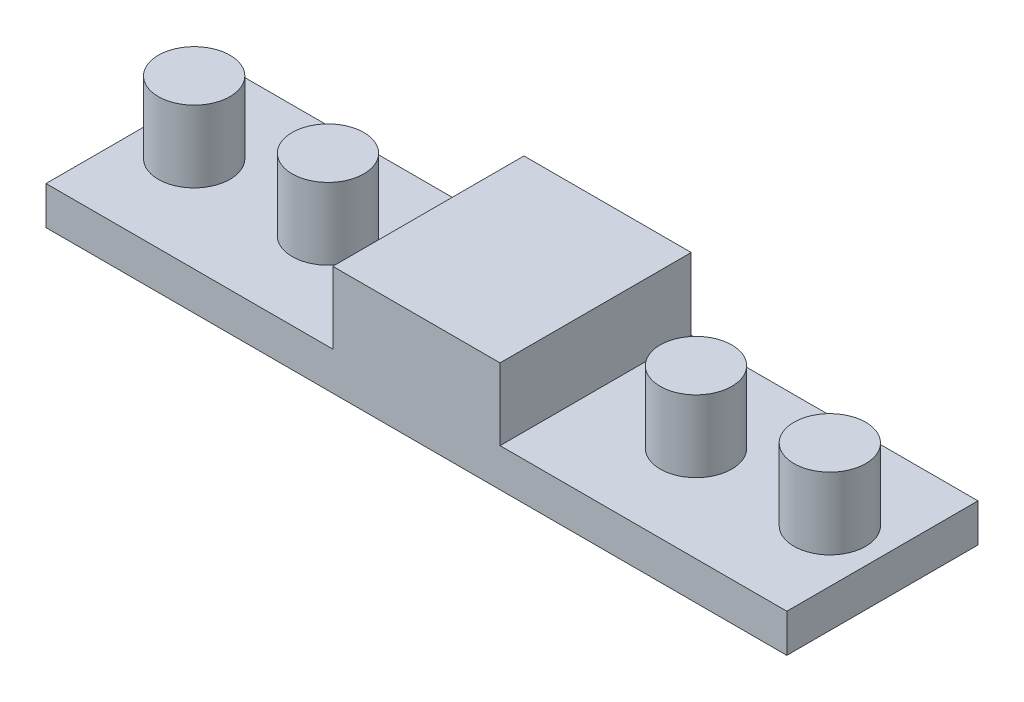
ISO-10303-21;
HEADER;
FILE_DESCRIPTION(('STEP AP214'),'2;1');
FILE_NAME('part.step','',(''),(''),'','','');
FILE_SCHEMA(('AUTOMOTIVE_DESIGN { 1 0 10303 214 1 1 1 1 }'));
ENDSEC;
DATA;
#1=APPLICATION_CONTEXT('core data for automotive mechanical design processes');
#2=APPLICATION_PROTOCOL_DEFINITION('international standard','automotive_design',2000,#1);
#3=PRODUCT_CONTEXT('',#1,'mechanical');
#4=PRODUCT('Part','Part','',(#3));
#5=PRODUCT_RELATED_PRODUCT_CATEGORY('part','',(#4));
#6=PRODUCT_DEFINITION_FORMATION('','',#4);
#7=PRODUCT_DEFINITION_CONTEXT('part definition',#1,'design');
#8=PRODUCT_DEFINITION('design','',#6,#7);
#9=PRODUCT_DEFINITION_SHAPE('','',#8);
#10=(LENGTH_UNIT() NAMED_UNIT(*) SI_UNIT(.MILLI.,.METRE.));
#11=(NAMED_UNIT(*) PLANE_ANGLE_UNIT() SI_UNIT($,.RADIAN.));
#12=(NAMED_UNIT(*) SI_UNIT($,.STERADIAN.) SOLID_ANGLE_UNIT());
#13=UNCERTAINTY_MEASURE_WITH_UNIT(LENGTH_MEASURE(1.E-05),#10,'distance_accuracy_value','');
#14=(GEOMETRIC_REPRESENTATION_CONTEXT(3) GLOBAL_UNCERTAINTY_ASSIGNED_CONTEXT((#13)) GLOBAL_UNIT_ASSIGNED_CONTEXT((#10,
#11,#12)) REPRESENTATION_CONTEXT('',''));
#15=CARTESIAN_POINT('',(0.,0.,0.));
#16=DIRECTION('',(0.,0.,1.));
#17=DIRECTION('',(1.,0.,0.));
#18=AXIS2_PLACEMENT_3D('',#15,#16,#17);
#19=CARTESIAN_POINT('',(0.,0.8,0.));
#20=DIRECTION('',(0.,1.,0.));
#21=DIRECTION('',(0.,0.,1.));
#22=AXIS2_PLACEMENT_3D('',#19,#20,#21);
#23=PLANE('',#22);
#24=CARTESIAN_POINT('',(3.85,0.8,0.));
#25=DIRECTION('',(0.,1.,0.));
#26=DIRECTION('',(0.,0.,-1.));
#27=AXIS2_PLACEMENT_3D('',#24,#25,#26);
#28=CIRCLE('',#27,0.750000000000001);
#29=CARTESIAN_POINT('',(3.85,0.8,-0.750000000000007));
#30=VERTEX_POINT('',#29);
#31=EDGE_CURVE('E202',#30,#30,#28,.T.);
#32=ORIENTED_EDGE('',*,*,#31,.F.);
#33=EDGE_LOOP('',(#32));
#34=FACE_BOUND('',#33,.T.);
#35=CARTESIAN_POINT('',(6.65,0.8,0.));
#36=DIRECTION('',(0.,1.,0.));
#37=DIRECTION('',(0.,0.,-1.));
#38=AXIS2_PLACEMENT_3D('',#35,#36,#37);
#39=CIRCLE('',#38,0.750000000000001);
#40=CARTESIAN_POINT('',(6.65,0.8,-0.749999999999988));
#41=VERTEX_POINT('',#40);
#42=EDGE_CURVE('E196',#41,#41,#39,.T.);
#43=ORIENTED_EDGE('',*,*,#42,.F.);
#44=EDGE_LOOP('',(#43));
#45=FACE_BOUND('',#44,.T.);
#46=DIRECTION('',(1.,0.,0.));
#47=VECTOR('',#46,1.);
#48=CARTESIAN_POINT('',(0.,0.8,-2.));
#49=LINE('',#48,#47);
#50=CARTESIAN_POINT('',(1.75,0.8,-2.));
#51=VERTEX_POINT('',#50);
#52=CARTESIAN_POINT('',(7.75,0.8,-2.));
#53=VERTEX_POINT('',#52);
#54=EDGE_CURVE('E52',#51,#53,#49,.T.);
#55=ORIENTED_EDGE('',*,*,#54,.F.);
#56=DIRECTION('',(0.,0.,1.));
#57=VECTOR('',#56,1.);
#58=CARTESIAN_POINT('',(1.75,0.8,0.));
#59=LINE('',#58,#57);
#60=CARTESIAN_POINT('',(1.75,0.8,2.));
#61=VERTEX_POINT('',#60);
#62=EDGE_CURVE('E122',#51,#61,#59,.T.);
#63=ORIENTED_EDGE('',*,*,#62,.T.);
#64=DIRECTION('',(1.,0.,0.));
#65=VECTOR('',#64,1.);
#66=CARTESIAN_POINT('',(0.,0.8,2.));
#67=LINE('',#66,#65);
#68=CARTESIAN_POINT('',(7.75,0.8,2.));
#69=VERTEX_POINT('',#68);
#70=EDGE_CURVE('E139',#61,#69,#67,.T.);
#71=ORIENTED_EDGE('',*,*,#70,.T.);
#72=DIRECTION('',(0.,0.,-1.));
#73=VECTOR('',#72,1.);
#74=CARTESIAN_POINT('',(7.75,0.8,0.));
#75=LINE('',#74,#73);
#76=EDGE_CURVE('E138',#69,#53,#75,.T.);
#77=ORIENTED_EDGE('',*,*,#76,.T.);
#78=EDGE_LOOP('',(#55,#63,#71,#77));
#79=FACE_BOUND('',#78,.T.);
#80=ADVANCED_FACE('F37',(#34,#45,#79),#23,.T.);
#81=CARTESIAN_POINT('',(0.,0.8,2.));
#82=DIRECTION('',(0.,0.,-1.));
#83=DIRECTION('',(-1.,0.,0.));
#84=AXIS2_PLACEMENT_3D('',#81,#82,#83);
#85=PLANE('',#84);
#86=DIRECTION('',(1.,0.,0.));
#87=VECTOR('',#86,1.);
#88=CARTESIAN_POINT('',(0.,0.,2.));
#89=LINE('',#88,#87);
#90=CARTESIAN_POINT('',(-7.75,0.,2.));
#91=VERTEX_POINT('',#90);
#92=CARTESIAN_POINT('',(7.75,0.,2.));
#93=VERTEX_POINT('',#92);
#94=EDGE_CURVE('E127',#91,#93,#89,.T.);
#95=ORIENTED_EDGE('',*,*,#94,.T.);
#96=DIRECTION('',(0.,-1.,0.));
#97=VECTOR('',#96,1.);
#98=CARTESIAN_POINT('',(7.75,0.8,2.));
#99=LINE('',#98,#97);
#100=EDGE_CURVE('E11',#69,#93,#99,.T.);
#101=ORIENTED_EDGE('',*,*,#100,.F.);
#102=ORIENTED_EDGE('',*,*,#70,.F.);
#103=DIRECTION('',(0.,-1.,0.));
#104=VECTOR('',#103,1.);
#105=CARTESIAN_POINT('',(1.75,2.3,2.));
#106=LINE('',#105,#104);
#107=CARTESIAN_POINT('',(1.75,2.3,2.));
#108=VERTEX_POINT('',#107);
#109=EDGE_CURVE('E132',#108,#61,#106,.T.);
#110=ORIENTED_EDGE('',*,*,#109,.F.);
#111=DIRECTION('',(-1.,0.,0.));
#112=VECTOR('',#111,1.);
#113=CARTESIAN_POINT('',(0.,2.3,2.));
#114=LINE('',#113,#112);
#115=CARTESIAN_POINT('',(-1.75,2.3,2.));
#116=VERTEX_POINT('',#115);
#117=EDGE_CURVE('E113',#108,#116,#114,.T.);
#118=ORIENTED_EDGE('',*,*,#117,.T.);
#119=DIRECTION('',(0.,-1.,0.));
#120=VECTOR('',#119,1.);
#121=CARTESIAN_POINT('',(-1.75,2.3,2.));
#122=LINE('',#121,#120);
#123=CARTESIAN_POINT('',(-1.75,0.8,2.));
#124=VERTEX_POINT('',#123);
#125=EDGE_CURVE('E109',#116,#124,#122,.T.);
#126=ORIENTED_EDGE('',*,*,#125,.T.);
#127=CARTESIAN_POINT('',(-7.75,0.8,2.));
#128=VERTEX_POINT('',#127);
#129=EDGE_CURVE('E136',#128,#124,#67,.T.);
#130=ORIENTED_EDGE('',*,*,#129,.F.);
#131=DIRECTION('',(0.,-1.,0.));
#132=VECTOR('',#131,1.);
#133=CARTESIAN_POINT('',(-7.75,0.8,2.));
#134=LINE('',#133,#132);
#135=EDGE_CURVE('E144',#128,#91,#134,.T.);
#136=ORIENTED_EDGE('',*,*,#135,.T.);
#137=EDGE_LOOP('',(#95,#101,#102,#110,#118,#126,#130,#136));
#138=FACE_BOUND('',#137,.T.);
#139=ADVANCED_FACE('F39',(#138),#85,.F.);
#140=CARTESIAN_POINT('',(7.75,0.8,0.));
#141=DIRECTION('',(-1.,0.,0.));
#142=DIRECTION('',(0.,0.,1.));
#143=AXIS2_PLACEMENT_3D('',#140,#141,#142);
#144=PLANE('',#143);
#145=DIRECTION('',(0.,0.,-1.));
#146=VECTOR('',#145,1.);
#147=CARTESIAN_POINT('',(7.75,0.,0.));
#148=LINE('',#147,#146);
#149=CARTESIAN_POINT('',(7.75,0.,-2.));
#150=VERTEX_POINT('',#149);
#151=EDGE_CURVE('E130',#93,#150,#148,.T.);
#152=ORIENTED_EDGE('',*,*,#151,.T.);
#153=DIRECTION('',(0.,-1.,0.));
#154=VECTOR('',#153,1.);
#155=CARTESIAN_POINT('',(7.75,0.8,-2.));
#156=LINE('',#155,#154);
#157=EDGE_CURVE('E45',#53,#150,#156,.T.);
#158=ORIENTED_EDGE('',*,*,#157,.F.);
#159=ORIENTED_EDGE('',*,*,#76,.F.);
#160=ORIENTED_EDGE('',*,*,#100,.T.);
#161=EDGE_LOOP('',(#152,#158,#159,#160));
#162=FACE_BOUND('',#161,.T.);
#163=ADVANCED_FACE('F159',(#162),#144,.F.);
#164=CARTESIAN_POINT('',(0.,0.8,-2.));
#165=DIRECTION('',(0.,0.,-1.));
#166=DIRECTION('',(-1.,0.,0.));
#167=AXIS2_PLACEMENT_3D('',#164,#165,#166);
#168=PLANE('',#167);
#169=DIRECTION('',(1.,0.,0.));
#170=VECTOR('',#169,1.);
#171=CARTESIAN_POINT('',(0.,0.,-2.));
#172=LINE('',#171,#170);
#173=CARTESIAN_POINT('',(-7.75,0.,-2.));
#174=VERTEX_POINT('',#173);
#175=EDGE_CURVE('E148',#174,#150,#172,.T.);
#176=ORIENTED_EDGE('',*,*,#175,.F.);
#177=DIRECTION('',(0.,-1.,0.));
#178=VECTOR('',#177,1.);
#179=CARTESIAN_POINT('',(-7.75,0.8,-2.));
#180=LINE('',#179,#178);
#181=CARTESIAN_POINT('',(-7.75,0.8,-2.));
#182=VERTEX_POINT('',#181);
#183=EDGE_CURVE('E155',#182,#174,#180,.T.);
#184=ORIENTED_EDGE('',*,*,#183,.F.);
#185=CARTESIAN_POINT('',(-1.75,0.8,-2.));
#186=VERTEX_POINT('',#185);
#187=EDGE_CURVE('E126',#182,#186,#49,.T.);
#188=ORIENTED_EDGE('',*,*,#187,.T.);
#189=DIRECTION('',(0.,-1.,0.));
#190=VECTOR('',#189,1.);
#191=CARTESIAN_POINT('',(-1.75,2.3,-2.));
#192=LINE('',#191,#190);
#193=CARTESIAN_POINT('',(-1.75,2.3,-2.));
#194=VERTEX_POINT('',#193);
#195=EDGE_CURVE('E107',#194,#186,#192,.T.);
#196=ORIENTED_EDGE('',*,*,#195,.F.);
#197=DIRECTION('',(-1.,0.,0.));
#198=VECTOR('',#197,1.);
#199=CARTESIAN_POINT('',(0.,2.3,-2.));
#200=LINE('',#199,#198);
#201=CARTESIAN_POINT('',(1.75,2.3,-2.));
#202=VERTEX_POINT('',#201);
#203=EDGE_CURVE('E114',#202,#194,#200,.T.);
#204=ORIENTED_EDGE('',*,*,#203,.F.);
#205=DIRECTION('',(0.,-1.,0.));
#206=VECTOR('',#205,1.);
#207=CARTESIAN_POINT('',(1.75,2.3,-2.));
#208=LINE('',#207,#206);
#209=EDGE_CURVE('E180',#202,#51,#208,.T.);
#210=ORIENTED_EDGE('',*,*,#209,.T.);
#211=ORIENTED_EDGE('',*,*,#54,.T.);
#212=ORIENTED_EDGE('',*,*,#157,.T.);
#213=EDGE_LOOP('',(#176,#184,#188,#196,#204,#210,#211,#212));
#214=FACE_BOUND('',#213,.T.);
#215=ADVANCED_FACE('F125',(#214),#168,.T.);
#216=CARTESIAN_POINT('',(-7.75,0.8,0.));
#217=DIRECTION('',(-1.,0.,0.));
#218=DIRECTION('',(0.,0.,1.));
#219=AXIS2_PLACEMENT_3D('',#216,#217,#218);
#220=PLANE('',#219);
#221=DIRECTION('',(0.,0.,-1.));
#222=VECTOR('',#221,1.);
#223=CARTESIAN_POINT('',(-7.75,0.,0.));
#224=LINE('',#223,#222);
#225=EDGE_CURVE('E151',#91,#174,#224,.T.);
#226=ORIENTED_EDGE('',*,*,#225,.F.);
#227=ORIENTED_EDGE('',*,*,#135,.F.);
#228=DIRECTION('',(0.,0.,-1.));
#229=VECTOR('',#228,1.);
#230=CARTESIAN_POINT('',(-7.75,0.8,0.));
#231=LINE('',#230,#229);
#232=EDGE_CURVE('E142',#128,#182,#231,.T.);
#233=ORIENTED_EDGE('',*,*,#232,.T.);
#234=ORIENTED_EDGE('',*,*,#183,.T.);
#235=EDGE_LOOP('',(#226,#227,#233,#234));
#236=FACE_BOUND('',#235,.T.);
#237=ADVANCED_FACE('F166',(#236),#220,.T.);
#238=CARTESIAN_POINT('',(-6.65,0.8,0.));
#239=DIRECTION('',(0.,1.,0.));
#240=DIRECTION('',(0.,0.,1.));
#241=AXIS2_PLACEMENT_3D('',#238,#239,#240);
#242=CIRCLE('',#241,0.750000000000001);
#243=CARTESIAN_POINT('',(-6.65,0.8,0.750000000000016));
#244=VERTEX_POINT('',#243);
#245=EDGE_CURVE('E190',#244,#244,#242,.T.);
#246=ORIENTED_EDGE('',*,*,#245,.F.);
#247=EDGE_LOOP('',(#246));
#248=FACE_BOUND('',#247,.T.);
#249=CARTESIAN_POINT('',(-3.85,0.8,0.));
#250=DIRECTION('',(0.,1.,0.));
#251=DIRECTION('',(0.,0.,1.));
#252=AXIS2_PLACEMENT_3D('',#249,#250,#251);
#253=CIRCLE('',#252,0.75);
#254=CARTESIAN_POINT('',(-3.85,0.8,0.749999999999995));
#255=VERTEX_POINT('',#254);
#256=EDGE_CURVE('E175',#255,#255,#253,.T.);
#257=ORIENTED_EDGE('',*,*,#256,.F.);
#258=EDGE_LOOP('',(#257));
#259=FACE_BOUND('',#258,.T.);
#260=DIRECTION('',(0.,0.,1.));
#261=VECTOR('',#260,1.);
#262=CARTESIAN_POINT('',(-1.75,0.8,0.));
#263=LINE('',#262,#261);
#264=EDGE_CURVE('E60',#186,#124,#263,.T.);
#265=ORIENTED_EDGE('',*,*,#264,.F.);
#266=ORIENTED_EDGE('',*,*,#187,.F.);
#267=ORIENTED_EDGE('',*,*,#232,.F.);
#268=ORIENTED_EDGE('',*,*,#129,.T.);
#269=EDGE_LOOP('',(#265,#266,#267,#268));
#270=FACE_BOUND('',#269,.T.);
#271=ADVANCED_FACE('F169',(#248,#259,#270),#23,.T.);
#272=CARTESIAN_POINT('',(0.,0.,0.));
#273=DIRECTION('',(0.,1.,0.));
#274=DIRECTION('',(0.,0.,1.));
#275=AXIS2_PLACEMENT_3D('',#272,#273,#274);
#276=PLANE('',#275);
#277=ORIENTED_EDGE('',*,*,#94,.F.);
#278=ORIENTED_EDGE('',*,*,#225,.T.);
#279=ORIENTED_EDGE('',*,*,#175,.T.);
#280=ORIENTED_EDGE('',*,*,#151,.F.);
#281=EDGE_LOOP('',(#277,#278,#279,#280));
#282=FACE_BOUND('',#281,.T.);
#283=ADVANCED_FACE('F163',(#282),#276,.F.);
#284=CARTESIAN_POINT('',(-1.75,2.3,0.));
#285=DIRECTION('',(1.,0.,0.));
#286=DIRECTION('',(0.,0.,-1.));
#287=AXIS2_PLACEMENT_3D('',#284,#285,#286);
#288=PLANE('',#287);
#289=ORIENTED_EDGE('',*,*,#264,.T.);
#290=ORIENTED_EDGE('',*,*,#125,.F.);
#291=DIRECTION('',(0.,0.,1.));
#292=VECTOR('',#291,1.);
#293=CARTESIAN_POINT('',(-1.75,2.3,0.));
#294=LINE('',#293,#292);
#295=EDGE_CURVE('E103',#194,#116,#294,.T.);
#296=ORIENTED_EDGE('',*,*,#295,.F.);
#297=ORIENTED_EDGE('',*,*,#195,.T.);
#298=EDGE_LOOP('',(#289,#290,#296,#297));
#299=FACE_BOUND('',#298,.T.);
#300=ADVANCED_FACE('F105',(#299),#288,.F.);
#301=CARTESIAN_POINT('',(1.75,2.3,0.));
#302=DIRECTION('',(1.,0.,0.));
#303=DIRECTION('',(0.,0.,-1.));
#304=AXIS2_PLACEMENT_3D('',#301,#302,#303);
#305=PLANE('',#304);
#306=ORIENTED_EDGE('',*,*,#62,.F.);
#307=ORIENTED_EDGE('',*,*,#209,.F.);
#308=DIRECTION('',(0.,0.,1.));
#309=VECTOR('',#308,1.);
#310=CARTESIAN_POINT('',(1.75,2.3,0.));
#311=LINE('',#310,#309);
#312=EDGE_CURVE('E120',#202,#108,#311,.T.);
#313=ORIENTED_EDGE('',*,*,#312,.T.);
#314=ORIENTED_EDGE('',*,*,#109,.T.);
#315=EDGE_LOOP('',(#306,#307,#313,#314));
#316=FACE_BOUND('',#315,.T.);
#317=ADVANCED_FACE('F184',(#316),#305,.T.);
#318=CARTESIAN_POINT('',(0.,2.3,0.));
#319=DIRECTION('',(0.,1.,0.));
#320=DIRECTION('',(0.,0.,1.));
#321=AXIS2_PLACEMENT_3D('',#318,#319,#320);
#322=PLANE('',#321);
#323=ORIENTED_EDGE('',*,*,#203,.T.);
#324=ORIENTED_EDGE('',*,*,#295,.T.);
#325=ORIENTED_EDGE('',*,*,#117,.F.);
#326=ORIENTED_EDGE('',*,*,#312,.F.);
#327=EDGE_LOOP('',(#323,#324,#325,#326));
#328=FACE_BOUND('',#327,.T.);
#329=ADVANCED_FACE('F118',(#328),#322,.T.);
#330=CARTESIAN_POINT('',(-3.85,2.3,0.));
#331=DIRECTION('',(0.,-1.,0.));
#332=DIRECTION('',(0.,0.,-1.));
#333=AXIS2_PLACEMENT_3D('',#330,#331,#332);
#334=CYLINDRICAL_SURFACE('',#333,0.75);
#335=CARTESIAN_POINT('',(-3.85,2.3,0.));
#336=DIRECTION('',(0.,1.,0.));
#337=DIRECTION('',(0.,0.,1.));
#338=AXIS2_PLACEMENT_3D('',#335,#336,#337);
#339=CIRCLE('',#338,0.75);
#340=CARTESIAN_POINT('',(-3.85,2.3,0.749999999999995));
#341=VERTEX_POINT('',#340);
#342=EDGE_CURVE('E171',#341,#341,#339,.T.);
#343=ORIENTED_EDGE('',*,*,#342,.F.);
#344=EDGE_LOOP('',(#343));
#345=FACE_BOUND('',#344,.T.);
#346=ORIENTED_EDGE('',*,*,#256,.T.);
#347=EDGE_LOOP('',(#346));
#348=FACE_BOUND('',#347,.T.);
#349=ADVANCED_FACE('F244',(#345,#348),#334,.T.);
#350=CARTESIAN_POINT('',(-3.85,2.3,0.));
#351=DIRECTION('',(0.,1.,0.));
#352=DIRECTION('',(0.,0.,1.));
#353=AXIS2_PLACEMENT_3D('',#350,#351,#352);
#354=PLANE('',#353);
#355=ORIENTED_EDGE('',*,*,#342,.T.);
#356=EDGE_LOOP('',(#355));
#357=FACE_BOUND('',#356,.T.);
#358=ADVANCED_FACE('F240',(#357),#354,.T.);
#359=CARTESIAN_POINT('',(-6.65,2.3,0.));
#360=DIRECTION('',(0.,-1.,0.));
#361=DIRECTION('',(0.,0.,-1.));
#362=AXIS2_PLACEMENT_3D('',#359,#360,#361);
#363=CYLINDRICAL_SURFACE('',#362,0.750000000000001);
#364=CARTESIAN_POINT('',(-6.65,2.3,0.));
#365=DIRECTION('',(0.,1.,0.));
#366=DIRECTION('',(0.,0.,1.));
#367=AXIS2_PLACEMENT_3D('',#364,#365,#366);
#368=CIRCLE('',#367,0.750000000000001);
#369=CARTESIAN_POINT('',(-6.65,2.3,0.750000000000016));
#370=VERTEX_POINT('',#369);
#371=EDGE_CURVE('E188',#370,#370,#368,.T.);
#372=ORIENTED_EDGE('',*,*,#371,.F.);
#373=EDGE_LOOP('',(#372));
#374=FACE_BOUND('',#373,.T.);
#375=ORIENTED_EDGE('',*,*,#245,.T.);
#376=EDGE_LOOP('',(#375));
#377=FACE_BOUND('',#376,.T.);
#378=ADVANCED_FACE('F233',(#374,#377),#363,.T.);
#379=CARTESIAN_POINT('',(-6.65,2.3,0.));
#380=DIRECTION('',(0.,1.,0.));
#381=DIRECTION('',(0.,0.,1.));
#382=AXIS2_PLACEMENT_3D('',#379,#380,#381);
#383=PLANE('',#382);
#384=ORIENTED_EDGE('',*,*,#371,.T.);
#385=EDGE_LOOP('',(#384));
#386=FACE_BOUND('',#385,.T.);
#387=ADVANCED_FACE('F224',(#386),#383,.T.);
#388=CARTESIAN_POINT('',(6.65,2.3,0.));
#389=DIRECTION('',(0.,-1.,0.));
#390=DIRECTION('',(0.,0.,-1.));
#391=AXIS2_PLACEMENT_3D('',#388,#389,#390);
#392=CYLINDRICAL_SURFACE('',#391,0.750000000000001);
#393=CARTESIAN_POINT('',(6.65,2.3,0.));
#394=DIRECTION('',(0.,1.,0.));
#395=DIRECTION('',(0.,0.,-1.));
#396=AXIS2_PLACEMENT_3D('',#393,#394,#395);
#397=CIRCLE('',#396,0.750000000000001);
#398=CARTESIAN_POINT('',(6.65,2.3,-0.749999999999988));
#399=VERTEX_POINT('',#398);
#400=EDGE_CURVE('E193',#399,#399,#397,.T.);
#401=ORIENTED_EDGE('',*,*,#400,.F.);
#402=EDGE_LOOP('',(#401));
#403=FACE_BOUND('',#402,.T.);
#404=ORIENTED_EDGE('',*,*,#42,.T.);
#405=EDGE_LOOP('',(#404));
#406=FACE_BOUND('',#405,.T.);
#407=ADVANCED_FACE('F222',(#403,#406),#392,.T.);
#408=CARTESIAN_POINT('',(6.65,2.3,0.));
#409=DIRECTION('',(0.,-1.,0.));
#410=DIRECTION('',(0.,0.,-1.));
#411=AXIS2_PLACEMENT_3D('',#408,#409,#410);
#412=PLANE('',#411);
#413=ORIENTED_EDGE('',*,*,#400,.T.);
#414=EDGE_LOOP('',(#413));
#415=FACE_BOUND('',#414,.T.);
#416=ADVANCED_FACE('F213',(#415),#412,.F.);
#417=CARTESIAN_POINT('',(3.85,2.3,0.));
#418=DIRECTION('',(0.,-1.,0.));
#419=DIRECTION('',(0.,0.,-1.));
#420=AXIS2_PLACEMENT_3D('',#417,#418,#419);
#421=CYLINDRICAL_SURFACE('',#420,0.750000000000001);
#422=CARTESIAN_POINT('',(3.85,2.3,0.));
#423=DIRECTION('',(0.,1.,0.));
#424=DIRECTION('',(0.,0.,-1.));
#425=AXIS2_PLACEMENT_3D('',#422,#423,#424);
#426=CIRCLE('',#425,0.750000000000001);
#427=CARTESIAN_POINT('',(3.85,2.3,-0.750000000000007));
#428=VERTEX_POINT('',#427);
#429=EDGE_CURVE('E199',#428,#428,#426,.T.);
#430=ORIENTED_EDGE('',*,*,#429,.F.);
#431=EDGE_LOOP('',(#430));
#432=FACE_BOUND('',#431,.T.);
#433=ORIENTED_EDGE('',*,*,#31,.T.);
#434=EDGE_LOOP('',(#433));
#435=FACE_BOUND('',#434,.T.);
#436=ADVANCED_FACE('F210',(#432,#435),#421,.T.);
#437=CARTESIAN_POINT('',(3.85,2.3,0.));
#438=DIRECTION('',(0.,-1.,0.));
#439=DIRECTION('',(0.,0.,-1.));
#440=AXIS2_PLACEMENT_3D('',#437,#438,#439);
#441=PLANE('',#440);
#442=ORIENTED_EDGE('',*,*,#429,.T.);
#443=EDGE_LOOP('',(#442));
#444=FACE_BOUND('',#443,.T.);
#445=ADVANCED_FACE('F208',(#444),#441,.F.);
#446=CLOSED_SHELL('',(#80,#139,#163,#215,#237,#271,#283,#300,#317,#329,#349,#358,#378,#387,#407,
#416,#436,#445));
#447=MANIFOLD_SOLID_BREP('B2',#446);
#448=ADVANCED_BREP_SHAPE_REPRESENTATION('',(#18,#447),#14);
#449=SHAPE_DEFINITION_REPRESENTATION(#9,#448);
ENDSEC;
END-ISO-10303-21;
